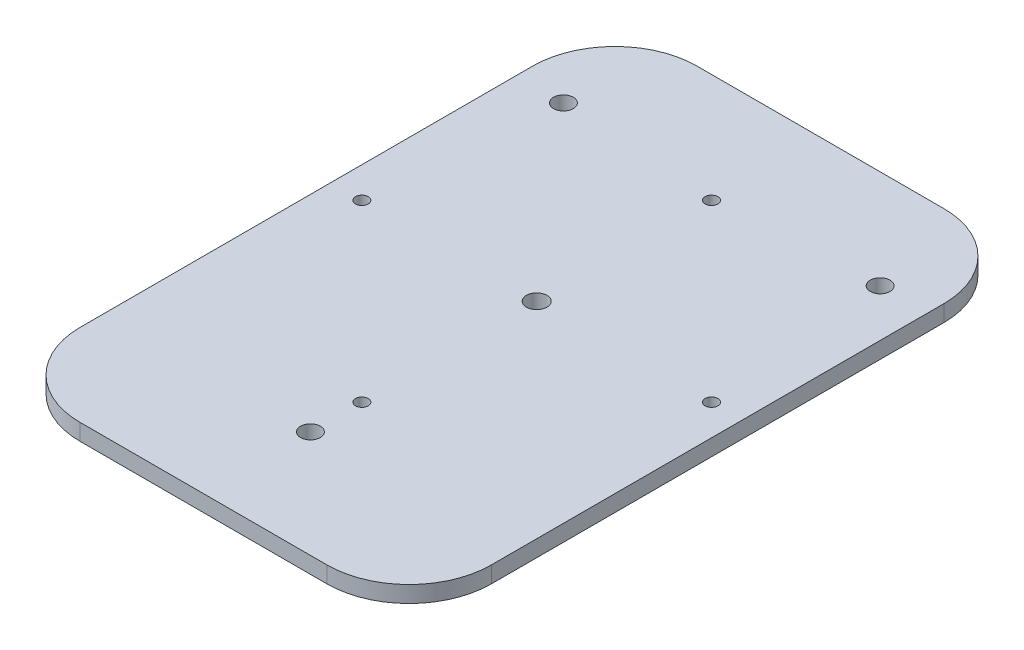
ISO-10303-21;
HEADER;
FILE_DESCRIPTION(('STEP AP214'),'2;1');
FILE_NAME('part.step','',(''),(''),'','','');
FILE_SCHEMA(('AUTOMOTIVE_DESIGN { 1 0 10303 214 1 1 1 1 }'));
ENDSEC;
DATA;
#1=APPLICATION_CONTEXT('core data for automotive mechanical design processes');
#2=APPLICATION_PROTOCOL_DEFINITION('international standard','automotive_design',2000,#1);
#3=PRODUCT_CONTEXT('',#1,'mechanical');
#4=PRODUCT('Part','Part','',(#3));
#5=PRODUCT_RELATED_PRODUCT_CATEGORY('part','',(#4));
#6=PRODUCT_DEFINITION_FORMATION('','',#4);
#7=PRODUCT_DEFINITION_CONTEXT('part definition',#1,'design');
#8=PRODUCT_DEFINITION('design','',#6,#7);
#9=PRODUCT_DEFINITION_SHAPE('','',#8);
#10=(LENGTH_UNIT() NAMED_UNIT(*) SI_UNIT(.MILLI.,.METRE.));
#11=(NAMED_UNIT(*) PLANE_ANGLE_UNIT() SI_UNIT($,.RADIAN.));
#12=(NAMED_UNIT(*) SI_UNIT($,.STERADIAN.) SOLID_ANGLE_UNIT());
#13=UNCERTAINTY_MEASURE_WITH_UNIT(LENGTH_MEASURE(1.E-05),#10,'distance_accuracy_value','');
#14=(GEOMETRIC_REPRESENTATION_CONTEXT(3) GLOBAL_UNCERTAINTY_ASSIGNED_CONTEXT((#13)) GLOBAL_UNIT_ASSIGNED_CONTEXT((#10,
#11,#12)) REPRESENTATION_CONTEXT('',''));
#15=CARTESIAN_POINT('',(0.,0.,0.));
#16=DIRECTION('',(0.,0.,1.));
#17=DIRECTION('',(1.,0.,0.));
#18=AXIS2_PLACEMENT_3D('',#15,#16,#17);
#19=CARTESIAN_POINT('',(-30.3811983825092,4.,-56.1435951475275));
#20=DIRECTION('',(0.,-1.,0.));
#21=DIRECTION('',(0.,0.,-1.));
#22=AXIS2_PLACEMENT_3D('',#19,#20,#21);
#23=CYLINDRICAL_SURFACE('',#22,20.);
#24=CARTESIAN_POINT('',(-30.3811983825092,0.,-56.1435951475275));
#25=DIRECTION('',(0.,1.,0.));
#26=DIRECTION('',(0.,0.,1.));
#27=AXIS2_PLACEMENT_3D('',#24,#25,#26);
#28=CIRCLE('',#27,20.);
#29=CARTESIAN_POINT('',(-50.3811983825092,0.,-56.1435951475273));
#30=VERTEX_POINT('',#29);
#31=CARTESIAN_POINT('',(-30.381198382509,0.,-76.1435951475275));
#32=VERTEX_POINT('',#31);
#33=EDGE_CURVE('E149',#30,#32,#28,.F.);
#34=ORIENTED_EDGE('',*,*,#33,.F.);
#35=DIRECTION('',(0.,-1.,0.));
#36=VECTOR('',#35,1.);
#37=CARTESIAN_POINT('',(-50.3811983825092,4.,-56.1435951475273));
#38=LINE('',#37,#36);
#39=CARTESIAN_POINT('',(-50.3811983825092,4.,-56.1435951475273));
#40=VERTEX_POINT('',#39);
#41=EDGE_CURVE('E11',#40,#30,#38,.T.);
#42=ORIENTED_EDGE('',*,*,#41,.F.);
#43=CARTESIAN_POINT('',(-30.3811983825092,4.,-56.1435951475275));
#44=DIRECTION('',(0.,1.,0.));
#45=DIRECTION('',(0.,0.,1.));
#46=AXIS2_PLACEMENT_3D('',#43,#44,#45);
#47=CIRCLE('',#46,20.);
#48=CARTESIAN_POINT('',(-30.381198382509,4.,-76.1435951475275));
#49=VERTEX_POINT('',#48);
#50=EDGE_CURVE('E399',#40,#49,#47,.F.);
#51=ORIENTED_EDGE('',*,*,#50,.T.);
#52=DIRECTION('',(0.,-1.,0.));
#53=VECTOR('',#52,1.);
#54=CARTESIAN_POINT('',(-30.381198382509,4.,-76.1435951475275));
#55=LINE('',#54,#53);
#56=EDGE_CURVE('E51',#49,#32,#55,.T.);
#57=ORIENTED_EDGE('',*,*,#56,.T.);
#58=EDGE_LOOP('',(#34,#42,#51,#57));
#59=FACE_BOUND('',#58,.T.);
#60=ADVANCED_FACE('F34',(#59),#23,.T.);
#61=CARTESIAN_POINT('',(-50.3811983825092,4.,0.));
#62=DIRECTION('',(-1.,0.,0.));
#63=DIRECTION('',(0.,0.,1.));
#64=AXIS2_PLACEMENT_3D('',#61,#62,#63);
#65=PLANE('',#64);
#66=DIRECTION('',(0.,0.,-1.));
#67=VECTOR('',#66,1.);
#68=CARTESIAN_POINT('',(-50.3811983825092,0.,0.));
#69=LINE('',#68,#67);
#70=CARTESIAN_POINT('',(-50.3811983825092,0.,53.8564048524723));
#71=VERTEX_POINT('',#70);
#72=EDGE_CURVE('E146',#71,#30,#69,.T.);
#73=ORIENTED_EDGE('',*,*,#72,.F.);
#74=DIRECTION('',(0.,-1.,0.));
#75=VECTOR('',#74,1.);
#76=CARTESIAN_POINT('',(-50.3811983825092,4.,53.8564048524723));
#77=LINE('',#76,#75);
#78=CARTESIAN_POINT('',(-50.3811983825092,4.,53.8564048524723));
#79=VERTEX_POINT('',#78);
#80=EDGE_CURVE('E43',#79,#71,#77,.T.);
#81=ORIENTED_EDGE('',*,*,#80,.F.);
#82=DIRECTION('',(0.,0.,-1.));
#83=VECTOR('',#82,1.);
#84=CARTESIAN_POINT('',(-50.3811983825092,4.,0.));
#85=LINE('',#84,#83);
#86=EDGE_CURVE('E397',#79,#40,#85,.T.);
#87=ORIENTED_EDGE('',*,*,#86,.T.);
#88=ORIENTED_EDGE('',*,*,#41,.T.);
#89=EDGE_LOOP('',(#73,#81,#87,#88));
#90=FACE_BOUND('',#89,.T.);
#91=ADVANCED_FACE('F147',(#90),#65,.T.);
#92=CARTESIAN_POINT('',(-30.3811983825092,4.,53.8564048524725));
#93=DIRECTION('',(0.,-1.,0.));
#94=DIRECTION('',(0.,0.,-1.));
#95=AXIS2_PLACEMENT_3D('',#92,#93,#94);
#96=CYLINDRICAL_SURFACE('',#95,20.);
#97=CARTESIAN_POINT('',(-30.3811983825092,0.,53.8564048524725));
#98=DIRECTION('',(0.,1.,0.));
#99=DIRECTION('',(0.,0.,1.));
#100=AXIS2_PLACEMENT_3D('',#97,#98,#99);
#101=CIRCLE('',#100,20.);
#102=CARTESIAN_POINT('',(-30.381198382509,0.,73.8564048524725));
#103=VERTEX_POINT('',#102);
#104=EDGE_CURVE('E139',#103,#71,#101,.F.);
#105=ORIENTED_EDGE('',*,*,#104,.F.);
#106=DIRECTION('',(0.,-1.,0.));
#107=VECTOR('',#106,1.);
#108=CARTESIAN_POINT('',(-30.381198382509,4.,73.8564048524725));
#109=LINE('',#108,#107);
#110=CARTESIAN_POINT('',(-30.381198382509,4.,73.8564048524725));
#111=VERTEX_POINT('',#110);
#112=EDGE_CURVE('E132',#111,#103,#109,.T.);
#113=ORIENTED_EDGE('',*,*,#112,.F.);
#114=CARTESIAN_POINT('',(-30.3811983825092,4.,53.8564048524725));
#115=DIRECTION('',(0.,1.,0.));
#116=DIRECTION('',(0.,0.,1.));
#117=AXIS2_PLACEMENT_3D('',#114,#115,#116);
#118=CIRCLE('',#117,20.);
#119=EDGE_CURVE('E141',#111,#79,#118,.F.);
#120=ORIENTED_EDGE('',*,*,#119,.T.);
#121=ORIENTED_EDGE('',*,*,#80,.T.);
#122=EDGE_LOOP('',(#105,#113,#120,#121));
#123=FACE_BOUND('',#122,.T.);
#124=ADVANCED_FACE('F137',(#123),#96,.T.);
#125=CARTESIAN_POINT('',(0.,4.,73.8564048524725));
#126=DIRECTION('',(0.,0.,-1.));
#127=DIRECTION('',(-1.,0.,0.));
#128=AXIS2_PLACEMENT_3D('',#125,#126,#127);
#129=PLANE('',#128);
#130=DIRECTION('',(1.,0.,0.));
#131=VECTOR('',#130,1.);
#132=CARTESIAN_POINT('',(0.,0.,73.8564048524725));
#133=LINE('',#132,#131);
#134=CARTESIAN_POINT('',(29.6188016174907,0.,73.8564048524725));
#135=VERTEX_POINT('',#134);
#136=EDGE_CURVE('E155',#103,#135,#133,.T.);
#137=ORIENTED_EDGE('',*,*,#136,.T.);
#138=DIRECTION('',(0.,-1.,0.));
#139=VECTOR('',#138,1.);
#140=CARTESIAN_POINT('',(29.6188016174907,4.,73.8564048524725));
#141=LINE('',#140,#139);
#142=CARTESIAN_POINT('',(29.6188016174907,4.,73.8564048524725));
#143=VERTEX_POINT('',#142);
#144=EDGE_CURVE('E125',#143,#135,#141,.T.);
#145=ORIENTED_EDGE('',*,*,#144,.F.);
#146=DIRECTION('',(1.,0.,0.));
#147=VECTOR('',#146,1.);
#148=CARTESIAN_POINT('',(0.,4.,73.8564048524725));
#149=LINE('',#148,#147);
#150=EDGE_CURVE('E395',#111,#143,#149,.T.);
#151=ORIENTED_EDGE('',*,*,#150,.F.);
#152=ORIENTED_EDGE('',*,*,#112,.T.);
#153=EDGE_LOOP('',(#137,#145,#151,#152));
#154=FACE_BOUND('',#153,.T.);
#155=ADVANCED_FACE('F289',(#154),#129,.F.);
#156=CARTESIAN_POINT('',(29.6188016174908,4.,53.8564048524725));
#157=DIRECTION('',(0.,-1.,0.));
#158=DIRECTION('',(0.,0.,-1.));
#159=AXIS2_PLACEMENT_3D('',#156,#157,#158);
#160=CYLINDRICAL_SURFACE('',#159,20.);
#161=CARTESIAN_POINT('',(29.6188016174908,0.,53.8564048524725));
#162=DIRECTION('',(0.,1.,0.));
#163=DIRECTION('',(0.,0.,1.));
#164=AXIS2_PLACEMENT_3D('',#161,#162,#163);
#165=CIRCLE('',#164,20.);
#166=CARTESIAN_POINT('',(49.6188016174908,0.,53.8564048524723));
#167=VERTEX_POINT('',#166);
#168=EDGE_CURVE('E157',#135,#167,#165,.T.);
#169=ORIENTED_EDGE('',*,*,#168,.T.);
#170=DIRECTION('',(0.,-1.,0.));
#171=VECTOR('',#170,1.);
#172=CARTESIAN_POINT('',(49.6188016174908,4.,53.8564048524723));
#173=LINE('',#172,#171);
#174=CARTESIAN_POINT('',(49.6188016174908,4.,53.8564048524723));
#175=VERTEX_POINT('',#174);
#176=EDGE_CURVE('E123',#175,#167,#173,.T.);
#177=ORIENTED_EDGE('',*,*,#176,.F.);
#178=CARTESIAN_POINT('',(29.6188016174908,4.,53.8564048524725));
#179=DIRECTION('',(0.,1.,0.));
#180=DIRECTION('',(0.,0.,1.));
#181=AXIS2_PLACEMENT_3D('',#178,#179,#180);
#182=CIRCLE('',#181,20.);
#183=EDGE_CURVE('E116',#143,#175,#182,.T.);
#184=ORIENTED_EDGE('',*,*,#183,.F.);
#185=ORIENTED_EDGE('',*,*,#144,.T.);
#186=EDGE_LOOP('',(#169,#177,#184,#185));
#187=FACE_BOUND('',#186,.T.);
#188=ADVANCED_FACE('F284',(#187),#160,.T.);
#189=CARTESIAN_POINT('',(49.6188016174908,4.,0.));
#190=DIRECTION('',(-1.,0.,0.));
#191=DIRECTION('',(0.,0.,1.));
#192=AXIS2_PLACEMENT_3D('',#189,#190,#191);
#193=PLANE('',#192);
#194=DIRECTION('',(0.,0.,-1.));
#195=VECTOR('',#194,1.);
#196=CARTESIAN_POINT('',(49.6188016174908,0.,0.));
#197=LINE('',#196,#195);
#198=CARTESIAN_POINT('',(49.6188016174908,0.,-56.1435951475273));
#199=VERTEX_POINT('',#198);
#200=EDGE_CURVE('E122',#167,#199,#197,.T.);
#201=ORIENTED_EDGE('',*,*,#200,.T.);
#202=DIRECTION('',(0.,-1.,0.));
#203=VECTOR('',#202,1.);
#204=CARTESIAN_POINT('',(49.6188016174908,4.,-56.1435951475273));
#205=LINE('',#204,#203);
#206=CARTESIAN_POINT('',(49.6188016174908,4.,-56.1435951475273));
#207=VERTEX_POINT('',#206);
#208=EDGE_CURVE('E105',#207,#199,#205,.T.);
#209=ORIENTED_EDGE('',*,*,#208,.F.);
#210=DIRECTION('',(0.,0.,-1.));
#211=VECTOR('',#210,1.);
#212=CARTESIAN_POINT('',(49.6188016174908,4.,0.));
#213=LINE('',#212,#211);
#214=EDGE_CURVE('E110',#175,#207,#213,.T.);
#215=ORIENTED_EDGE('',*,*,#214,.F.);
#216=ORIENTED_EDGE('',*,*,#176,.T.);
#217=EDGE_LOOP('',(#201,#209,#215,#216));
#218=FACE_BOUND('',#217,.T.);
#219=ADVANCED_FACE('F121',(#218),#193,.F.);
#220=CARTESIAN_POINT('',(29.6188016174908,4.,-56.1435951475275));
#221=DIRECTION('',(0.,-1.,0.));
#222=DIRECTION('',(0.,0.,-1.));
#223=AXIS2_PLACEMENT_3D('',#220,#221,#222);
#224=CYLINDRICAL_SURFACE('',#223,20.);
#225=CARTESIAN_POINT('',(29.6188016174908,0.,-56.1435951475275));
#226=DIRECTION('',(0.,1.,0.));
#227=DIRECTION('',(0.,0.,1.));
#228=AXIS2_PLACEMENT_3D('',#225,#226,#227);
#229=CIRCLE('',#228,20.);
#230=CARTESIAN_POINT('',(29.6188016174907,0.,-76.1435951475275));
#231=VERTEX_POINT('',#230);
#232=EDGE_CURVE('E164',#199,#231,#229,.T.);
#233=ORIENTED_EDGE('',*,*,#232,.T.);
#234=DIRECTION('',(0.,-1.,0.));
#235=VECTOR('',#234,1.);
#236=CARTESIAN_POINT('',(29.6188016174907,4.,-76.1435951475275));
#237=LINE('',#236,#235);
#238=CARTESIAN_POINT('',(29.6188016174907,4.,-76.1435951475275));
#239=VERTEX_POINT('',#238);
#240=EDGE_CURVE('E77',#239,#231,#237,.T.);
#241=ORIENTED_EDGE('',*,*,#240,.F.);
#242=CARTESIAN_POINT('',(29.6188016174908,4.,-56.1435951475275));
#243=DIRECTION('',(0.,1.,0.));
#244=DIRECTION('',(0.,0.,1.));
#245=AXIS2_PLACEMENT_3D('',#242,#243,#244);
#246=CIRCLE('',#245,20.);
#247=EDGE_CURVE('E101',#207,#239,#246,.T.);
#248=ORIENTED_EDGE('',*,*,#247,.F.);
#249=ORIENTED_EDGE('',*,*,#208,.T.);
#250=EDGE_LOOP('',(#233,#241,#248,#249));
#251=FACE_BOUND('',#250,.T.);
#252=ADVANCED_FACE('F103',(#251),#224,.T.);
#253=CARTESIAN_POINT('',(38.1188016174908,4.,-52.1435951475275));
#254=DIRECTION('',(0.,-1.,0.));
#255=DIRECTION('',(0.,0.,-1.));
#256=AXIS2_PLACEMENT_3D('',#253,#254,#255);
#257=CYLINDRICAL_SURFACE('',#256,2.4);
#258=CARTESIAN_POINT('',(38.1188016174908,4.,-52.1435951475275));
#259=DIRECTION('',(0.,1.,0.));
#260=DIRECTION('',(0.,0.,1.));
#261=AXIS2_PLACEMENT_3D('',#258,#259,#260);
#262=CIRCLE('',#261,2.4);
#263=CARTESIAN_POINT('',(38.1188016174908,4.,-49.7435951475275));
#264=VERTEX_POINT('',#263);
#265=EDGE_CURVE('E180',#264,#264,#262,.T.);
#266=ORIENTED_EDGE('',*,*,#265,.T.);
#267=EDGE_LOOP('',(#266));
#268=FACE_BOUND('',#267,.T.);
#269=CARTESIAN_POINT('',(38.1188016174908,0.,-52.1435951475275));
#270=DIRECTION('',(0.,1.,0.));
#271=DIRECTION('',(0.,0.,1.));
#272=AXIS2_PLACEMENT_3D('',#269,#270,#271);
#273=CIRCLE('',#272,2.4);
#274=CARTESIAN_POINT('',(38.1188016174908,0.,-49.7435951475275));
#275=VERTEX_POINT('',#274);
#276=EDGE_CURVE('E172',#275,#275,#273,.T.);
#277=ORIENTED_EDGE('',*,*,#276,.F.);
#278=EDGE_LOOP('',(#277));
#279=FACE_BOUND('',#278,.T.);
#280=ADVANCED_FACE('F215',(#268,#279),#257,.F.);
#281=CARTESIAN_POINT('',(-0.381198382509172,4.,-7.1435951475275));
#282=DIRECTION('',(0.,-1.,0.));
#283=DIRECTION('',(0.,0.,-1.));
#284=AXIS2_PLACEMENT_3D('',#281,#282,#283);
#285=CYLINDRICAL_SURFACE('',#284,2.5);
#286=CARTESIAN_POINT('',(-0.381198382509172,4.,-7.1435951475275));
#287=DIRECTION('',(0.,1.,0.));
#288=DIRECTION('',(0.,0.,1.));
#289=AXIS2_PLACEMENT_3D('',#286,#287,#288);
#290=CIRCLE('',#289,2.5);
#291=CARTESIAN_POINT('',(-0.381198382509172,4.,-4.6435951475275));
#292=VERTEX_POINT('',#291);
#293=EDGE_CURVE('E185',#292,#292,#290,.T.);
#294=ORIENTED_EDGE('',*,*,#293,.T.);
#295=EDGE_LOOP('',(#294));
#296=FACE_BOUND('',#295,.T.);
#297=CARTESIAN_POINT('',(-0.381198382509172,0.,-7.1435951475275));
#298=DIRECTION('',(0.,1.,0.));
#299=DIRECTION('',(0.,0.,1.));
#300=AXIS2_PLACEMENT_3D('',#297,#298,#299);
#301=CIRCLE('',#300,2.5);
#302=CARTESIAN_POINT('',(-0.381198382509172,0.,-4.6435951475275));
#303=VERTEX_POINT('',#302);
#304=EDGE_CURVE('E169',#303,#303,#301,.T.);
#305=ORIENTED_EDGE('',*,*,#304,.F.);
#306=EDGE_LOOP('',(#305));
#307=FACE_BOUND('',#306,.T.);
#308=ADVANCED_FACE('F206',(#296,#307),#285,.F.);
#309=CARTESIAN_POINT('',(0.,4.,-76.1435951475275));
#310=DIRECTION('',(0.,0.,-1.));
#311=DIRECTION('',(-1.,0.,0.));
#312=AXIS2_PLACEMENT_3D('',#309,#310,#311);
#313=PLANE('',#312);
#314=DIRECTION('',(1.,0.,0.));
#315=VECTOR('',#314,1.);
#316=CARTESIAN_POINT('',(0.,0.,-76.1435951475275));
#317=LINE('',#316,#315);
#318=EDGE_CURVE('E166',#32,#231,#317,.T.);
#319=ORIENTED_EDGE('',*,*,#318,.F.);
#320=ORIENTED_EDGE('',*,*,#56,.F.);
#321=DIRECTION('',(1.,0.,0.));
#322=VECTOR('',#321,1.);
#323=CARTESIAN_POINT('',(0.,4.,-76.1435951475275));
#324=LINE('',#323,#322);
#325=EDGE_CURVE('E109',#49,#239,#324,.T.);
#326=ORIENTED_EDGE('',*,*,#325,.T.);
#327=ORIENTED_EDGE('',*,*,#240,.T.);
#328=EDGE_LOOP('',(#319,#320,#326,#327));
#329=FACE_BOUND('',#328,.T.);
#330=ADVANCED_FACE('F203',(#329),#313,.T.);
#331=CARTESIAN_POINT('',(-0.38119838250916,4.,47.8564048524725));
#332=DIRECTION('',(0.,-1.,0.));
#333=DIRECTION('',(0.,0.,-1.));
#334=AXIS2_PLACEMENT_3D('',#331,#332,#333);
#335=CYLINDRICAL_SURFACE('',#334,2.4);
#336=CARTESIAN_POINT('',(-0.38119838250916,4.,47.8564048524725));
#337=DIRECTION('',(0.,1.,0.));
#338=DIRECTION('',(0.,0.,1.));
#339=AXIS2_PLACEMENT_3D('',#336,#337,#338);
#340=CIRCLE('',#339,2.4);
#341=CARTESIAN_POINT('',(-0.38119838250916,4.,50.2564048524725));
#342=VERTEX_POINT('',#341);
#343=EDGE_CURVE('E408',#342,#342,#340,.T.);
#344=ORIENTED_EDGE('',*,*,#343,.T.);
#345=EDGE_LOOP('',(#344));
#346=FACE_BOUND('',#345,.T.);
#347=CARTESIAN_POINT('',(-0.38119838250916,0.,47.8564048524725));
#348=DIRECTION('',(0.,1.,0.));
#349=DIRECTION('',(0.,0.,1.));
#350=AXIS2_PLACEMENT_3D('',#347,#348,#349);
#351=CIRCLE('',#350,2.4);
#352=CARTESIAN_POINT('',(-0.38119838250916,0.,50.2564048524725));
#353=VERTEX_POINT('',#352);
#354=EDGE_CURVE('E201',#353,#353,#351,.T.);
#355=ORIENTED_EDGE('',*,*,#354,.F.);
#356=EDGE_LOOP('',(#355));
#357=FACE_BOUND('',#356,.T.);
#358=ADVANCED_FACE('F205',(#346,#357),#335,.F.);
#359=CARTESIAN_POINT('',(-42.8811983825092,4.,-7.1435951475275));
#360=DIRECTION('',(0.,-1.,0.));
#361=DIRECTION('',(0.,0.,-1.));
#362=AXIS2_PLACEMENT_3D('',#359,#360,#361);
#363=CYLINDRICAL_SURFACE('',#362,1.55);
#364=CARTESIAN_POINT('',(-42.8811983825092,4.,-7.1435951475275));
#365=DIRECTION('',(0.,1.,0.));
#366=DIRECTION('',(0.,0.,1.));
#367=AXIS2_PLACEMENT_3D('',#364,#365,#366);
#368=CIRCLE('',#367,1.55);
#369=CARTESIAN_POINT('',(-42.8811983825092,4.,-5.59359514752749));
#370=VERTEX_POINT('',#369);
#371=EDGE_CURVE('E410',#370,#370,#368,.T.);
#372=ORIENTED_EDGE('',*,*,#371,.T.);
#373=EDGE_LOOP('',(#372));
#374=FACE_BOUND('',#373,.T.);
#375=CARTESIAN_POINT('',(-42.8811983825092,0.,-7.1435951475275));
#376=DIRECTION('',(0.,1.,0.));
#377=DIRECTION('',(0.,0.,1.));
#378=AXIS2_PLACEMENT_3D('',#375,#376,#377);
#379=CIRCLE('',#378,1.55);
#380=CARTESIAN_POINT('',(-42.8811983825092,0.,-5.59359514752749));
#381=VERTEX_POINT('',#380);
#382=EDGE_CURVE('E198',#381,#381,#379,.T.);
#383=ORIENTED_EDGE('',*,*,#382,.F.);
#384=EDGE_LOOP('',(#383));
#385=FACE_BOUND('',#384,.T.);
#386=ADVANCED_FACE('F212',(#374,#385),#363,.F.);
#387=CARTESIAN_POINT('',(42.1188016174908,4.,-7.1435951475275));
#388=DIRECTION('',(0.,-1.,0.));
#389=DIRECTION('',(0.,0.,-1.));
#390=AXIS2_PLACEMENT_3D('',#387,#388,#389);
#391=CYLINDRICAL_SURFACE('',#390,1.55);
#392=CARTESIAN_POINT('',(42.1188016174908,4.,-7.1435951475275));
#393=DIRECTION('',(0.,1.,0.));
#394=DIRECTION('',(0.,0.,1.));
#395=AXIS2_PLACEMENT_3D('',#392,#393,#394);
#396=CIRCLE('',#395,1.55);
#397=CARTESIAN_POINT('',(42.1188016174908,4.,-5.5935951475275));
#398=VERTEX_POINT('',#397);
#399=EDGE_CURVE('E415',#398,#398,#396,.T.);
#400=ORIENTED_EDGE('',*,*,#399,.T.);
#401=EDGE_LOOP('',(#400));
#402=FACE_BOUND('',#401,.T.);
#403=CARTESIAN_POINT('',(42.1188016174908,0.,-7.1435951475275));
#404=DIRECTION('',(0.,1.,0.));
#405=DIRECTION('',(0.,0.,1.));
#406=AXIS2_PLACEMENT_3D('',#403,#404,#405);
#407=CIRCLE('',#406,1.55);
#408=CARTESIAN_POINT('',(42.1188016174908,0.,-5.5935951475275));
#409=VERTEX_POINT('',#408);
#410=EDGE_CURVE('E195',#409,#409,#407,.T.);
#411=ORIENTED_EDGE('',*,*,#410,.F.);
#412=EDGE_LOOP('',(#411));
#413=FACE_BOUND('',#412,.T.);
#414=ADVANCED_FACE('F229',(#402,#413),#391,.F.);
#415=CARTESIAN_POINT('',(-0.381198382509166,4.,35.3564048524725));
#416=DIRECTION('',(0.,-1.,0.));
#417=DIRECTION('',(0.,0.,-1.));
#418=AXIS2_PLACEMENT_3D('',#415,#416,#417);
#419=CYLINDRICAL_SURFACE('',#418,1.55);
#420=CARTESIAN_POINT('',(-0.381198382509166,4.,35.3564048524725));
#421=DIRECTION('',(0.,1.,0.));
#422=DIRECTION('',(0.,0.,1.));
#423=AXIS2_PLACEMENT_3D('',#420,#421,#422);
#424=CIRCLE('',#423,1.55);
#425=CARTESIAN_POINT('',(-0.381198382509166,4.,36.9064048524725));
#426=VERTEX_POINT('',#425);
#427=EDGE_CURVE('E244',#426,#426,#424,.T.);
#428=ORIENTED_EDGE('',*,*,#427,.T.);
#429=EDGE_LOOP('',(#428));
#430=FACE_BOUND('',#429,.T.);
#431=CARTESIAN_POINT('',(-0.381198382509166,0.,35.3564048524725));
#432=DIRECTION('',(0.,1.,0.));
#433=DIRECTION('',(0.,0.,1.));
#434=AXIS2_PLACEMENT_3D('',#431,#432,#433);
#435=CIRCLE('',#434,1.55);
#436=CARTESIAN_POINT('',(-0.381198382509166,0.,36.9064048524725));
#437=VERTEX_POINT('',#436);
#438=EDGE_CURVE('E192',#437,#437,#435,.T.);
#439=ORIENTED_EDGE('',*,*,#438,.F.);
#440=EDGE_LOOP('',(#439));
#441=FACE_BOUND('',#440,.T.);
#442=ADVANCED_FACE('F232',(#430,#441),#419,.F.);
#443=CARTESIAN_POINT('',(-0.381198382509171,4.,-49.6435951475275));
#444=DIRECTION('',(0.,-1.,0.));
#445=DIRECTION('',(0.,0.,-1.));
#446=AXIS2_PLACEMENT_3D('',#443,#444,#445);
#447=CYLINDRICAL_SURFACE('',#446,1.55);
#448=CARTESIAN_POINT('',(-0.381198382509171,4.,-49.6435951475275));
#449=DIRECTION('',(0.,1.,0.));
#450=DIRECTION('',(0.,0.,1.));
#451=AXIS2_PLACEMENT_3D('',#448,#449,#450);
#452=CIRCLE('',#451,1.55);
#453=CARTESIAN_POINT('',(-0.381198382509171,4.,-48.0935951475275));
#454=VERTEX_POINT('',#453);
#455=EDGE_CURVE('E177',#454,#454,#452,.T.);
#456=ORIENTED_EDGE('',*,*,#455,.T.);
#457=EDGE_LOOP('',(#456));
#458=FACE_BOUND('',#457,.T.);
#459=CARTESIAN_POINT('',(-0.381198382509171,0.,-49.6435951475275));
#460=DIRECTION('',(0.,1.,0.));
#461=DIRECTION('',(0.,0.,1.));
#462=AXIS2_PLACEMENT_3D('',#459,#460,#461);
#463=CIRCLE('',#462,1.55);
#464=CARTESIAN_POINT('',(-0.381198382509171,0.,-48.0935951475275));
#465=VERTEX_POINT('',#464);
#466=EDGE_CURVE('E189',#465,#465,#463,.T.);
#467=ORIENTED_EDGE('',*,*,#466,.F.);
#468=EDGE_LOOP('',(#467));
#469=FACE_BOUND('',#468,.T.);
#470=ADVANCED_FACE('F36',(#458,#469),#447,.F.);
#471=CARTESIAN_POINT('',(-38.8811983825092,4.,-52.1435951475275));
#472=DIRECTION('',(0.,-1.,0.));
#473=DIRECTION('',(0.,0.,-1.));
#474=AXIS2_PLACEMENT_3D('',#471,#472,#473);
#475=CYLINDRICAL_SURFACE('',#474,2.4);
#476=CARTESIAN_POINT('',(-38.8811983825092,4.,-52.1435951475275));
#477=DIRECTION('',(0.,1.,0.));
#478=DIRECTION('',(0.,0.,1.));
#479=AXIS2_PLACEMENT_3D('',#476,#477,#478);
#480=CIRCLE('',#479,2.4);
#481=CARTESIAN_POINT('',(-38.8811983825092,4.,-49.7435951475275));
#482=VERTEX_POINT('',#481);
#483=EDGE_CURVE('E178',#482,#482,#480,.F.);
#484=ORIENTED_EDGE('',*,*,#483,.F.);
#485=EDGE_LOOP('',(#484));
#486=FACE_BOUND('',#485,.T.);
#487=CARTESIAN_POINT('',(-38.8811983825092,0.,-52.1435951475275));
#488=DIRECTION('',(0.,1.,0.));
#489=DIRECTION('',(0.,0.,1.));
#490=AXIS2_PLACEMENT_3D('',#487,#488,#489);
#491=CIRCLE('',#490,2.4);
#492=CARTESIAN_POINT('',(-38.8811983825092,0.,-49.7435951475275));
#493=VERTEX_POINT('',#492);
#494=EDGE_CURVE('E175',#493,#493,#491,.F.);
#495=ORIENTED_EDGE('',*,*,#494,.T.);
#496=EDGE_LOOP('',(#495));
#497=FACE_BOUND('',#496,.T.);
#498=ADVANCED_FACE('F239',(#486,#497),#475,.F.);
#499=CARTESIAN_POINT('',(0.,4.,0.));
#500=DIRECTION('',(0.,1.,0.));
#501=DIRECTION('',(0.,0.,1.));
#502=AXIS2_PLACEMENT_3D('',#499,#500,#501);
#503=PLANE('',#502);
#504=ORIENTED_EDGE('',*,*,#455,.F.);
#505=EDGE_LOOP('',(#504));
#506=FACE_BOUND('',#505,.T.);
#507=ORIENTED_EDGE('',*,*,#427,.F.);
#508=EDGE_LOOP('',(#507));
#509=FACE_BOUND('',#508,.T.);
#510=ORIENTED_EDGE('',*,*,#399,.F.);
#511=EDGE_LOOP('',(#510));
#512=FACE_BOUND('',#511,.T.);
#513=ORIENTED_EDGE('',*,*,#371,.F.);
#514=EDGE_LOOP('',(#513));
#515=FACE_BOUND('',#514,.T.);
#516=ORIENTED_EDGE('',*,*,#343,.F.);
#517=EDGE_LOOP('',(#516));
#518=FACE_BOUND('',#517,.T.);
#519=ORIENTED_EDGE('',*,*,#50,.F.);
#520=ORIENTED_EDGE('',*,*,#86,.F.);
#521=ORIENTED_EDGE('',*,*,#119,.F.);
#522=ORIENTED_EDGE('',*,*,#150,.T.);
#523=ORIENTED_EDGE('',*,*,#183,.T.);
#524=ORIENTED_EDGE('',*,*,#214,.T.);
#525=ORIENTED_EDGE('',*,*,#247,.T.);
#526=ORIENTED_EDGE('',*,*,#325,.F.);
#527=EDGE_LOOP('',(#519,#520,#521,#522,#523,#524,#525,#526));
#528=FACE_BOUND('',#527,.T.);
#529=ORIENTED_EDGE('',*,*,#293,.F.);
#530=EDGE_LOOP('',(#529));
#531=FACE_BOUND('',#530,.T.);
#532=ORIENTED_EDGE('',*,*,#265,.F.);
#533=EDGE_LOOP('',(#532));
#534=FACE_BOUND('',#533,.T.);
#535=ORIENTED_EDGE('',*,*,#483,.T.);
#536=EDGE_LOOP('',(#535));
#537=FACE_BOUND('',#536,.T.);
#538=ADVANCED_FACE('F113',(#506,#509,#512,#515,#518,#528,#531,#534,#537),#503,.T.);
#539=CARTESIAN_POINT('',(0.,0.,0.));
#540=DIRECTION('',(0.,1.,0.));
#541=DIRECTION('',(0.,0.,1.));
#542=AXIS2_PLACEMENT_3D('',#539,#540,#541);
#543=PLANE('',#542);
#544=ORIENTED_EDGE('',*,*,#466,.T.);
#545=EDGE_LOOP('',(#544));
#546=FACE_BOUND('',#545,.T.);
#547=ORIENTED_EDGE('',*,*,#438,.T.);
#548=EDGE_LOOP('',(#547));
#549=FACE_BOUND('',#548,.T.);
#550=ORIENTED_EDGE('',*,*,#410,.T.);
#551=EDGE_LOOP('',(#550));
#552=FACE_BOUND('',#551,.T.);
#553=ORIENTED_EDGE('',*,*,#382,.T.);
#554=EDGE_LOOP('',(#553));
#555=FACE_BOUND('',#554,.T.);
#556=ORIENTED_EDGE('',*,*,#354,.T.);
#557=EDGE_LOOP('',(#556));
#558=FACE_BOUND('',#557,.T.);
#559=ORIENTED_EDGE('',*,*,#33,.T.);
#560=ORIENTED_EDGE('',*,*,#318,.T.);
#561=ORIENTED_EDGE('',*,*,#232,.F.);
#562=ORIENTED_EDGE('',*,*,#200,.F.);
#563=ORIENTED_EDGE('',*,*,#168,.F.);
#564=ORIENTED_EDGE('',*,*,#136,.F.);
#565=ORIENTED_EDGE('',*,*,#104,.T.);
#566=ORIENTED_EDGE('',*,*,#72,.T.);
#567=EDGE_LOOP('',(#559,#560,#561,#562,#563,#564,#565,#566));
#568=FACE_BOUND('',#567,.T.);
#569=ORIENTED_EDGE('',*,*,#304,.T.);
#570=EDGE_LOOP('',(#569));
#571=FACE_BOUND('',#570,.T.);
#572=ORIENTED_EDGE('',*,*,#276,.T.);
#573=EDGE_LOOP('',(#572));
#574=FACE_BOUND('',#573,.T.);
#575=ORIENTED_EDGE('',*,*,#494,.F.);
#576=EDGE_LOOP('',(#575));
#577=FACE_BOUND('',#576,.T.);
#578=ADVANCED_FACE('F152',(#546,#549,#552,#555,#558,#568,#571,#574,#577),#543,.F.);
#579=CLOSED_SHELL('',(#60,#91,#124,#155,#188,#219,#252,#280,#308,#330,#358,#386,#414,#442,#470,
#498,#538,#578));
#580=MANIFOLD_SOLID_BREP('B2',#579);
#581=ADVANCED_BREP_SHAPE_REPRESENTATION('',(#18,#580),#14);
#582=SHAPE_DEFINITION_REPRESENTATION(#9,#581);
ENDSEC;
END-ISO-10303-21;
